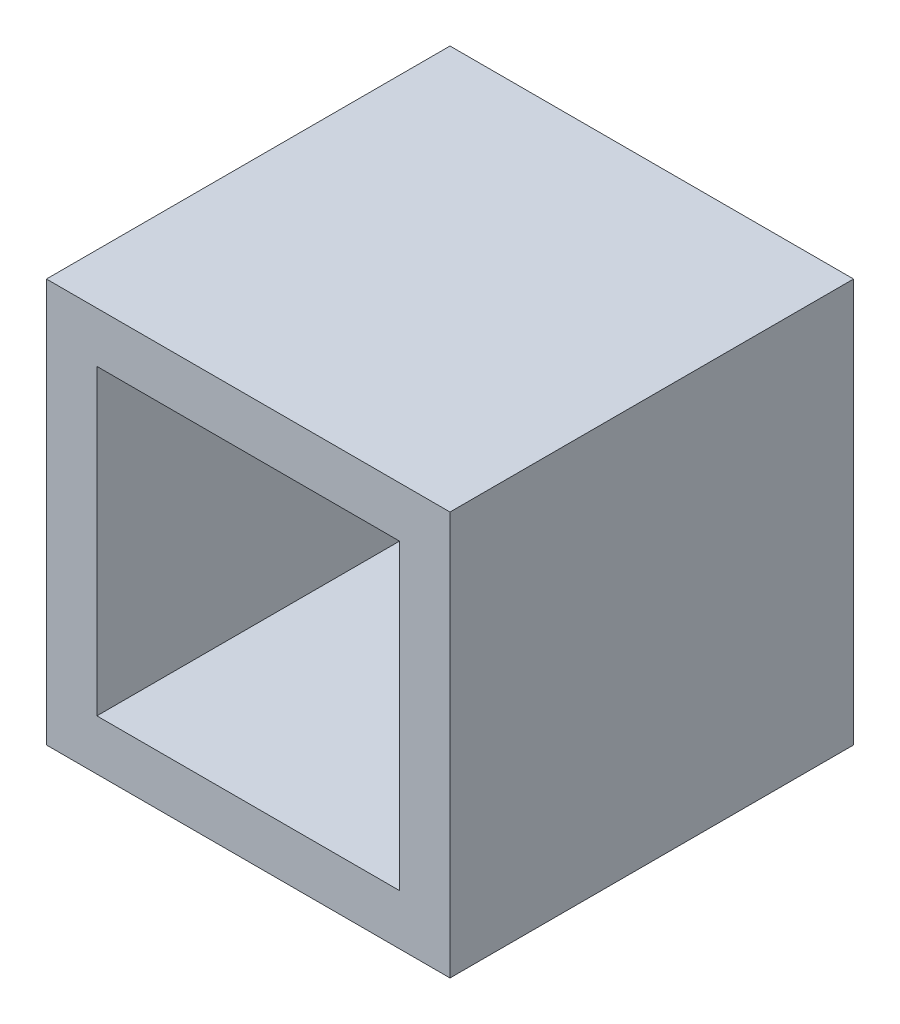
ISO-10303-21;
HEADER;
FILE_DESCRIPTION(('STEP AP214'),'2;1');
FILE_NAME('part.step','',(''),(''),'','','');
FILE_SCHEMA(('AUTOMOTIVE_DESIGN { 1 0 10303 214 1 1 1 1 }'));
ENDSEC;
DATA;
#1=APPLICATION_CONTEXT('core data for automotive mechanical design processes');
#2=APPLICATION_PROTOCOL_DEFINITION('international standard','automotive_design',2000,#1);
#3=PRODUCT_CONTEXT('',#1,'mechanical');
#4=PRODUCT('Part','Part','',(#3));
#5=PRODUCT_RELATED_PRODUCT_CATEGORY('part','',(#4));
#6=PRODUCT_DEFINITION_FORMATION('','',#4);
#7=PRODUCT_DEFINITION_CONTEXT('part definition',#1,'design');
#8=PRODUCT_DEFINITION('design','',#6,#7);
#9=PRODUCT_DEFINITION_SHAPE('','',#8);
#10=(LENGTH_UNIT() NAMED_UNIT(*) SI_UNIT(.MILLI.,.METRE.));
#11=(NAMED_UNIT(*) PLANE_ANGLE_UNIT() SI_UNIT($,.RADIAN.));
#12=(NAMED_UNIT(*) SI_UNIT($,.STERADIAN.) SOLID_ANGLE_UNIT());
#13=UNCERTAINTY_MEASURE_WITH_UNIT(LENGTH_MEASURE(1.E-05),#10,'distance_accuracy_value','');
#14=(GEOMETRIC_REPRESENTATION_CONTEXT(3) GLOBAL_UNCERTAINTY_ASSIGNED_CONTEXT((#13)) GLOBAL_UNIT_ASSIGNED_CONTEXT((#10,
#11,#12)) REPRESENTATION_CONTEXT('',''));
#15=CARTESIAN_POINT('',(0.,0.,0.));
#16=DIRECTION('',(0.,0.,1.));
#17=DIRECTION('',(1.,0.,0.));
#18=AXIS2_PLACEMENT_3D('',#15,#16,#17);
#19=CARTESIAN_POINT('',(12.7,12.7,25.4));
#20=DIRECTION('',(0.,0.,-1.));
#21=DIRECTION('',(-1.,0.,0.));
#22=AXIS2_PLACEMENT_3D('',#19,#20,#21);
#23=PLANE('',#22);
#24=DIRECTION('',(0.,1.,0.));
#25=VECTOR('',#24,1.);
#26=CARTESIAN_POINT('',(12.7,-12.7,25.4));
#27=LINE('',#26,#25);
#28=CARTESIAN_POINT('',(12.7,-12.7,25.4));
#29=VERTEX_POINT('',#28);
#30=CARTESIAN_POINT('',(12.7,12.7,25.4));
#31=VERTEX_POINT('',#30);
#32=EDGE_CURVE('E132',#29,#31,#27,.T.);
#33=ORIENTED_EDGE('',*,*,#32,.T.);
#34=DIRECTION('',(-1.,0.,0.));
#35=VECTOR('',#34,1.);
#36=CARTESIAN_POINT('',(-12.7,12.7,25.4));
#37=LINE('',#36,#35);
#38=CARTESIAN_POINT('',(-12.7,12.7,25.4));
#39=VERTEX_POINT('',#38);
#40=EDGE_CURVE('E135',#31,#39,#37,.T.);
#41=ORIENTED_EDGE('',*,*,#40,.T.);
#42=DIRECTION('',(0.,-1.,0.));
#43=VECTOR('',#42,1.);
#44=CARTESIAN_POINT('',(-12.7,-12.7,25.4));
#45=LINE('',#44,#43);
#46=CARTESIAN_POINT('',(-12.7,-12.7,25.4));
#47=VERTEX_POINT('',#46);
#48=EDGE_CURVE('E138',#39,#47,#45,.T.);
#49=ORIENTED_EDGE('',*,*,#48,.T.);
#50=DIRECTION('',(1.,0.,0.));
#51=VECTOR('',#50,1.);
#52=CARTESIAN_POINT('',(-12.7,-12.7,25.4));
#53=LINE('',#52,#51);
#54=EDGE_CURVE('E140',#47,#29,#53,.T.);
#55=ORIENTED_EDGE('',*,*,#54,.T.);
#56=EDGE_LOOP('',(#33,#41,#49,#55));
#57=FACE_BOUND('',#56,.T.);
#58=DIRECTION('',(1.,0.,0.));
#59=VECTOR('',#58,1.);
#60=CARTESIAN_POINT('',(-9.52499999999998,-9.525,25.4));
#61=LINE('',#60,#59);
#62=CARTESIAN_POINT('',(-9.52499999999998,-9.525,25.4));
#63=VERTEX_POINT('',#62);
#64=CARTESIAN_POINT('',(9.52500000000002,-9.525,25.4));
#65=VERTEX_POINT('',#64);
#66=EDGE_CURVE('E96',#63,#65,#61,.T.);
#67=ORIENTED_EDGE('',*,*,#66,.F.);
#68=DIRECTION('',(0.,-1.,0.));
#69=VECTOR('',#68,1.);
#70=CARTESIAN_POINT('',(-9.52499999999998,-9.525,25.4));
#71=LINE('',#70,#69);
#72=CARTESIAN_POINT('',(-9.52499999999998,9.525,25.4));
#73=VERTEX_POINT('',#72);
#74=EDGE_CURVE('E118',#73,#63,#71,.T.);
#75=ORIENTED_EDGE('',*,*,#74,.F.);
#76=DIRECTION('',(-1.,0.,0.));
#77=VECTOR('',#76,1.);
#78=CARTESIAN_POINT('',(-9.52499999999998,9.525,25.4));
#79=LINE('',#78,#77);
#80=CARTESIAN_POINT('',(9.52500000000002,9.525,25.4));
#81=VERTEX_POINT('',#80);
#82=EDGE_CURVE('E116',#81,#73,#79,.T.);
#83=ORIENTED_EDGE('',*,*,#82,.F.);
#84=DIRECTION('',(0.,1.,0.));
#85=VECTOR('',#84,1.);
#86=CARTESIAN_POINT('',(9.52500000000002,-9.525,25.4));
#87=LINE('',#86,#85);
#88=EDGE_CURVE('E104',#65,#81,#87,.T.);
#89=ORIENTED_EDGE('',*,*,#88,.F.);
#90=EDGE_LOOP('',(#67,#75,#83,#89));
#91=FACE_BOUND('',#90,.T.);
#92=ADVANCED_FACE('F31',(#57,#91),#23,.F.);
#93=CARTESIAN_POINT('',(12.7,12.7,0.));
#94=DIRECTION('',(0.,0.,-1.));
#95=DIRECTION('',(-1.,0.,0.));
#96=AXIS2_PLACEMENT_3D('',#93,#94,#95);
#97=PLANE('',#96);
#98=DIRECTION('',(0.,1.,0.));
#99=VECTOR('',#98,1.);
#100=CARTESIAN_POINT('',(12.7,-12.7,0.));
#101=LINE('',#100,#99);
#102=CARTESIAN_POINT('',(12.7,-12.7,0.));
#103=VERTEX_POINT('',#102);
#104=CARTESIAN_POINT('',(12.7,12.7,0.));
#105=VERTEX_POINT('',#104);
#106=EDGE_CURVE('E112',#103,#105,#101,.T.);
#107=ORIENTED_EDGE('',*,*,#106,.F.);
#108=DIRECTION('',(1.,0.,0.));
#109=VECTOR('',#108,1.);
#110=CARTESIAN_POINT('',(-12.7,-12.7,0.));
#111=LINE('',#110,#109);
#112=CARTESIAN_POINT('',(-12.7,-12.7,0.));
#113=VERTEX_POINT('',#112);
#114=EDGE_CURVE('E136',#113,#103,#111,.T.);
#115=ORIENTED_EDGE('',*,*,#114,.F.);
#116=DIRECTION('',(0.,-1.,0.));
#117=VECTOR('',#116,1.);
#118=CARTESIAN_POINT('',(-12.7,-12.7,0.));
#119=LINE('',#118,#117);
#120=CARTESIAN_POINT('',(-12.7,12.7,0.));
#121=VERTEX_POINT('',#120);
#122=EDGE_CURVE('E147',#121,#113,#119,.T.);
#123=ORIENTED_EDGE('',*,*,#122,.F.);
#124=DIRECTION('',(-1.,0.,0.));
#125=VECTOR('',#124,1.);
#126=CARTESIAN_POINT('',(-12.7,12.7,0.));
#127=LINE('',#126,#125);
#128=EDGE_CURVE('E145',#105,#121,#127,.T.);
#129=ORIENTED_EDGE('',*,*,#128,.F.);
#130=EDGE_LOOP('',(#107,#115,#123,#129));
#131=FACE_BOUND('',#130,.T.);
#132=DIRECTION('',(0.,-1.,0.));
#133=VECTOR('',#132,1.);
#134=CARTESIAN_POINT('',(-9.52499999999998,-9.525,0.));
#135=LINE('',#134,#133);
#136=CARTESIAN_POINT('',(-9.52499999999998,9.525,0.));
#137=VERTEX_POINT('',#136);
#138=CARTESIAN_POINT('',(-9.52499999999998,-9.52499999999999,0.));
#139=VERTEX_POINT('',#138);
#140=EDGE_CURVE('E105',#137,#139,#135,.T.);
#141=ORIENTED_EDGE('',*,*,#140,.T.);
#142=DIRECTION('',(1.,0.,0.));
#143=VECTOR('',#142,1.);
#144=CARTESIAN_POINT('',(-9.52499999999998,-9.525,0.));
#145=LINE('',#144,#143);
#146=CARTESIAN_POINT('',(9.52500000000002,-9.525,0.));
#147=VERTEX_POINT('',#146);
#148=EDGE_CURVE('E54',#139,#147,#145,.T.);
#149=ORIENTED_EDGE('',*,*,#148,.T.);
#150=DIRECTION('',(0.,1.,0.));
#151=VECTOR('',#150,1.);
#152=CARTESIAN_POINT('',(9.52500000000002,-9.525,0.));
#153=LINE('',#152,#151);
#154=CARTESIAN_POINT('',(9.52500000000002,9.525,0.));
#155=VERTEX_POINT('',#154);
#156=EDGE_CURVE('E111',#147,#155,#153,.T.);
#157=ORIENTED_EDGE('',*,*,#156,.T.);
#158=DIRECTION('',(-1.,0.,0.));
#159=VECTOR('',#158,1.);
#160=CARTESIAN_POINT('',(-9.52499999999998,9.525,0.));
#161=LINE('',#160,#159);
#162=EDGE_CURVE('E124',#155,#137,#161,.T.);
#163=ORIENTED_EDGE('',*,*,#162,.T.);
#164=EDGE_LOOP('',(#141,#149,#157,#163));
#165=FACE_BOUND('',#164,.T.);
#166=ADVANCED_FACE('F165',(#131,#165),#97,.T.);
#167=CARTESIAN_POINT('',(12.7,-12.7,25.4));
#168=DIRECTION('',(-1.,0.,0.));
#169=DIRECTION('',(0.,0.,1.));
#170=AXIS2_PLACEMENT_3D('',#167,#168,#169);
#171=PLANE('',#170);
#172=ORIENTED_EDGE('',*,*,#106,.T.);
#173=DIRECTION('',(0.,0.,-1.));
#174=VECTOR('',#173,1.);
#175=CARTESIAN_POINT('',(12.7,12.7,25.4));
#176=LINE('',#175,#174);
#177=EDGE_CURVE('E11',#31,#105,#176,.T.);
#178=ORIENTED_EDGE('',*,*,#177,.F.);
#179=ORIENTED_EDGE('',*,*,#32,.F.);
#180=DIRECTION('',(0.,0.,-1.));
#181=VECTOR('',#180,1.);
#182=CARTESIAN_POINT('',(12.7,-12.7,25.4));
#183=LINE('',#182,#181);
#184=EDGE_CURVE('E142',#29,#103,#183,.T.);
#185=ORIENTED_EDGE('',*,*,#184,.T.);
#186=EDGE_LOOP('',(#172,#178,#179,#185));
#187=FACE_BOUND('',#186,.T.);
#188=ADVANCED_FACE('F33',(#187),#171,.F.);
#189=CARTESIAN_POINT('',(-12.7,12.7,25.4));
#190=DIRECTION('',(0.,-1.,0.));
#191=DIRECTION('',(0.,0.,-1.));
#192=AXIS2_PLACEMENT_3D('',#189,#190,#191);
#193=PLANE('',#192);
#194=ORIENTED_EDGE('',*,*,#128,.T.);
#195=DIRECTION('',(0.,0.,-1.));
#196=VECTOR('',#195,1.);
#197=CARTESIAN_POINT('',(-12.7,12.7,25.4));
#198=LINE('',#197,#196);
#199=EDGE_CURVE('E39',#39,#121,#198,.T.);
#200=ORIENTED_EDGE('',*,*,#199,.F.);
#201=ORIENTED_EDGE('',*,*,#40,.F.);
#202=ORIENTED_EDGE('',*,*,#177,.T.);
#203=EDGE_LOOP('',(#194,#200,#201,#202));
#204=FACE_BOUND('',#203,.T.);
#205=ADVANCED_FACE('F175',(#204),#193,.F.);
#206=CARTESIAN_POINT('',(-12.7,-12.7,25.4));
#207=DIRECTION('',(1.,0.,0.));
#208=DIRECTION('',(0.,0.,-1.));
#209=AXIS2_PLACEMENT_3D('',#206,#207,#208);
#210=PLANE('',#209);
#211=ORIENTED_EDGE('',*,*,#122,.T.);
#212=DIRECTION('',(0.,0.,-1.));
#213=VECTOR('',#212,1.);
#214=CARTESIAN_POINT('',(-12.7,-12.7,25.4));
#215=LINE('',#214,#213);
#216=EDGE_CURVE('E152',#47,#113,#215,.T.);
#217=ORIENTED_EDGE('',*,*,#216,.F.);
#218=ORIENTED_EDGE('',*,*,#48,.F.);
#219=ORIENTED_EDGE('',*,*,#199,.T.);
#220=EDGE_LOOP('',(#211,#217,#218,#219));
#221=FACE_BOUND('',#220,.T.);
#222=ADVANCED_FACE('F159',(#221),#210,.F.);
#223=CARTESIAN_POINT('',(-12.7,-12.7,25.4));
#224=DIRECTION('',(0.,1.,0.));
#225=DIRECTION('',(0.,0.,1.));
#226=AXIS2_PLACEMENT_3D('',#223,#224,#225);
#227=PLANE('',#226);
#228=ORIENTED_EDGE('',*,*,#114,.T.);
#229=ORIENTED_EDGE('',*,*,#184,.F.);
#230=ORIENTED_EDGE('',*,*,#54,.F.);
#231=ORIENTED_EDGE('',*,*,#216,.T.);
#232=EDGE_LOOP('',(#228,#229,#230,#231));
#233=FACE_BOUND('',#232,.T.);
#234=ADVANCED_FACE('F169',(#233),#227,.F.);
#235=CARTESIAN_POINT('',(-9.52499999999998,-9.525,25.4));
#236=DIRECTION('',(0.,1.,0.));
#237=DIRECTION('',(0.,0.,1.));
#238=AXIS2_PLACEMENT_3D('',#235,#236,#237);
#239=PLANE('',#238);
#240=ORIENTED_EDGE('',*,*,#148,.F.);
#241=DIRECTION('',(0.,0.,-1.));
#242=VECTOR('',#241,1.);
#243=CARTESIAN_POINT('',(-9.52499999999998,-9.525,25.4));
#244=LINE('',#243,#242);
#245=EDGE_CURVE('E100',#63,#139,#244,.T.);
#246=ORIENTED_EDGE('',*,*,#245,.F.);
#247=ORIENTED_EDGE('',*,*,#66,.T.);
#248=DIRECTION('',(0.,0.,-1.));
#249=VECTOR('',#248,1.);
#250=CARTESIAN_POINT('',(9.52500000000002,-9.525,25.4));
#251=LINE('',#250,#249);
#252=EDGE_CURVE('E99',#65,#147,#251,.T.);
#253=ORIENTED_EDGE('',*,*,#252,.T.);
#254=EDGE_LOOP('',(#240,#246,#247,#253));
#255=FACE_BOUND('',#254,.T.);
#256=ADVANCED_FACE('F98',(#255),#239,.T.);
#257=CARTESIAN_POINT('',(9.52500000000002,-9.525,25.4));
#258=DIRECTION('',(-1.,0.,0.));
#259=DIRECTION('',(0.,0.,1.));
#260=AXIS2_PLACEMENT_3D('',#257,#258,#259);
#261=PLANE('',#260);
#262=ORIENTED_EDGE('',*,*,#156,.F.);
#263=ORIENTED_EDGE('',*,*,#252,.F.);
#264=ORIENTED_EDGE('',*,*,#88,.T.);
#265=DIRECTION('',(0.,0.,-1.));
#266=VECTOR('',#265,1.);
#267=CARTESIAN_POINT('',(9.52500000000002,9.525,25.4));
#268=LINE('',#267,#266);
#269=EDGE_CURVE('E113',#81,#155,#268,.T.);
#270=ORIENTED_EDGE('',*,*,#269,.T.);
#271=EDGE_LOOP('',(#262,#263,#264,#270));
#272=FACE_BOUND('',#271,.T.);
#273=ADVANCED_FACE('F108',(#272),#261,.T.);
#274=CARTESIAN_POINT('',(-9.52499999999998,9.525,25.4));
#275=DIRECTION('',(0.,-1.,0.));
#276=DIRECTION('',(0.,0.,-1.));
#277=AXIS2_PLACEMENT_3D('',#274,#275,#276);
#278=PLANE('',#277);
#279=ORIENTED_EDGE('',*,*,#162,.F.);
#280=ORIENTED_EDGE('',*,*,#269,.F.);
#281=ORIENTED_EDGE('',*,*,#82,.T.);
#282=DIRECTION('',(0.,0.,-1.));
#283=VECTOR('',#282,1.);
#284=CARTESIAN_POINT('',(-9.52499999999998,9.525,25.4));
#285=LINE('',#284,#283);
#286=EDGE_CURVE('E46',#73,#137,#285,.T.);
#287=ORIENTED_EDGE('',*,*,#286,.T.);
#288=EDGE_LOOP('',(#279,#280,#281,#287));
#289=FACE_BOUND('',#288,.T.);
#290=ADVANCED_FACE('F198',(#289),#278,.T.);
#291=CARTESIAN_POINT('',(-9.52499999999998,-9.525,25.4));
#292=DIRECTION('',(1.,0.,0.));
#293=DIRECTION('',(0.,0.,-1.));
#294=AXIS2_PLACEMENT_3D('',#291,#292,#293);
#295=PLANE('',#294);
#296=ORIENTED_EDGE('',*,*,#140,.F.);
#297=ORIENTED_EDGE('',*,*,#286,.F.);
#298=ORIENTED_EDGE('',*,*,#74,.T.);
#299=ORIENTED_EDGE('',*,*,#245,.T.);
#300=EDGE_LOOP('',(#296,#297,#298,#299));
#301=FACE_BOUND('',#300,.T.);
#302=ADVANCED_FACE('F202',(#301),#295,.T.);
#303=CLOSED_SHELL('',(#92,#166,#188,#205,#222,#234,#256,#273,#290,#302));
#304=MANIFOLD_SOLID_BREP('B2',#303);
#305=ADVANCED_BREP_SHAPE_REPRESENTATION('',(#18,#304),#14);
#306=SHAPE_DEFINITION_REPRESENTATION(#9,#305);
ENDSEC;
END-ISO-10303-21;
